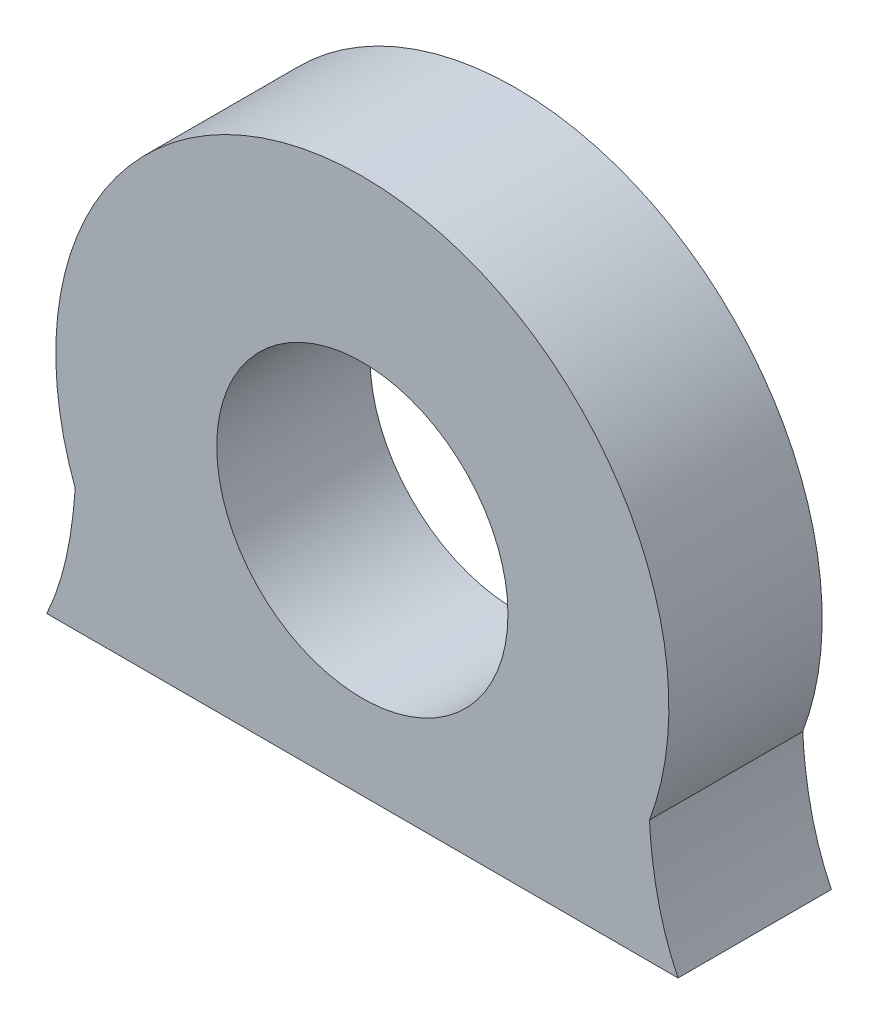
ISO-10303-21;
HEADER;
FILE_DESCRIPTION(('STEP AP214'),'2;1');
FILE_NAME('part.step','',(''),(''),'','','');
FILE_SCHEMA(('AUTOMOTIVE_DESIGN { 1 0 10303 214 1 1 1 1 }'));
ENDSEC;
DATA;
#1=APPLICATION_CONTEXT('core data for automotive mechanical design processes');
#2=APPLICATION_PROTOCOL_DEFINITION('international standard','automotive_design',2000,#1);
#3=PRODUCT_CONTEXT('',#1,'mechanical');
#4=PRODUCT('Part','Part','',(#3));
#5=PRODUCT_RELATED_PRODUCT_CATEGORY('part','',(#4));
#6=PRODUCT_DEFINITION_FORMATION('','',#4);
#7=PRODUCT_DEFINITION_CONTEXT('part definition',#1,'design');
#8=PRODUCT_DEFINITION('design','',#6,#7);
#9=PRODUCT_DEFINITION_SHAPE('','',#8);
#10=(LENGTH_UNIT() NAMED_UNIT(*) SI_UNIT(.MILLI.,.METRE.));
#11=(NAMED_UNIT(*) PLANE_ANGLE_UNIT() SI_UNIT($,.RADIAN.));
#12=(NAMED_UNIT(*) SI_UNIT($,.STERADIAN.) SOLID_ANGLE_UNIT());
#13=UNCERTAINTY_MEASURE_WITH_UNIT(LENGTH_MEASURE(1.E-05),#10,'distance_accuracy_value','');
#14=(GEOMETRIC_REPRESENTATION_CONTEXT(3) GLOBAL_UNCERTAINTY_ASSIGNED_CONTEXT((#13)) GLOBAL_UNIT_ASSIGNED_CONTEXT((#10,
#11,#12)) REPRESENTATION_CONTEXT('',''));
#15=CARTESIAN_POINT('',(0.,0.,0.));
#16=DIRECTION('',(0.,0.,1.));
#17=DIRECTION('',(1.,0.,0.));
#18=AXIS2_PLACEMENT_3D('',#15,#16,#17);
#19=CARTESIAN_POINT('',(-20.6297981408544,-15.0701075182187,10.));
#20=DIRECTION('',(0.,0.,1.));
#21=DIRECTION('',(1.,0.,0.));
#22=AXIS2_PLACEMENT_3D('',#19,#20,#21);
#23=PLANE('',#22);
#24=DIRECTION('',(-1.,0.,0.));
#25=VECTOR('',#24,1.);
#26=CARTESIAN_POINT('',(-25.,-15.,10.));
#27=LINE('',#26,#25);
#28=CARTESIAN_POINT('',(20.5984614943836,-15.,10.));
#29=VERTEX_POINT('',#28);
#30=CARTESIAN_POINT('',(-20.5962113508927,-15.,10.));
#31=VERTEX_POINT('',#30);
#32=EDGE_CURVE('E212',#29,#31,#27,.T.);
#33=ORIENTED_EDGE('',*,*,#32,.F.);
#34=CARTESIAN_POINT('',(25.,-20.,10.));
#35=CARTESIAN_POINT('',(19.2135652231186,-16.2566629580364,10.));
#36=CARTESIAN_POINT('',(18.7324741370569,-7.00674051927804,10.));
#37=B_SPLINE_CURVE_WITH_KNOTS('',2,(#34,#35,#36),.UNSPECIFIED.,.F.,.F.,(3,3),(0.,
0.763362406670874),.UNSPECIFIED.);
#38=CARTESIAN_POINT('',(18.7324741370569,-7.00674051927805,10.));
#39=VERTEX_POINT('',#38);
#40=EDGE_CURVE('E127',#29,#39,#37,.T.);
#41=ORIENTED_EDGE('',*,*,#40,.T.);
#42=CARTESIAN_POINT('',(0.,0.,10.));
#43=DIRECTION('',(0.,0.,1.));
#44=DIRECTION('',(1.,0.,0.));
#45=AXIS2_PLACEMENT_3D('',#42,#43,#44);
#46=CIRCLE('',#45,20.);
#47=CARTESIAN_POINT('',(-18.732474137057,-7.00674051927802,10.));
#48=VERTEX_POINT('',#47);
#49=EDGE_CURVE('E69',#39,#48,#46,.T.);
#50=ORIENTED_EDGE('',*,*,#49,.T.);
#51=CARTESIAN_POINT('',(-18.7324741370569,-7.00674051927804,10.));
#52=CARTESIAN_POINT('',(-19.3933592131804,-16.6368447767985,10.));
#53=CARTESIAN_POINT('',(-25.,-20.,10.));
#54=B_SPLINE_CURVE_WITH_KNOTS('',2,(#51,#52,#53),.UNSPECIFIED.,.F.,.F.,(3,3),(0.,
0.631911458603708),.UNSPECIFIED.);
#55=EDGE_CURVE('E92',#48,#31,#54,.T.);
#56=ORIENTED_EDGE('',*,*,#55,.T.);
#57=EDGE_LOOP('',(#33,#41,#50,#56));
#58=FACE_BOUND('',#57,.T.);
#59=CARTESIAN_POINT('',(0.,0.,10.));
#60=DIRECTION('',(0.,0.,1.));
#61=DIRECTION('',(1.,0.,0.));
#62=AXIS2_PLACEMENT_3D('',#59,#60,#61);
#63=CIRCLE('',#62,9.5);
#64=CARTESIAN_POINT('',(9.5,0.,10.));
#65=VERTEX_POINT('',#64);
#66=EDGE_CURVE('E104',#65,#65,#63,.T.);
#67=ORIENTED_EDGE('',*,*,#66,.F.);
#68=EDGE_LOOP('',(#67));
#69=FACE_BOUND('',#68,.T.);
#70=ADVANCED_FACE('F44',(#58,#69),#23,.T.);
#71=CARTESIAN_POINT('',(-20.6297981408544,-15.0701075182187,0.));
#72=DIRECTION('',(0.,0.,1.));
#73=DIRECTION('',(1.,0.,0.));
#74=AXIS2_PLACEMENT_3D('',#71,#72,#73);
#75=PLANE('',#74);
#76=CARTESIAN_POINT('',(25.,-20.,0.));
#77=CARTESIAN_POINT('',(19.2135652231186,-16.2566629580364,0.));
#78=CARTESIAN_POINT('',(18.7324741370569,-7.00674051927804,0.));
#79=B_SPLINE_CURVE_WITH_KNOTS('',2,(#76,#77,#78),.UNSPECIFIED.,.F.,.F.,(3,3),(0.,
0.763362406670874),.UNSPECIFIED.);
#80=CARTESIAN_POINT('',(20.5984614943836,-15.0000000000266,0.));
#81=VERTEX_POINT('',#80);
#82=CARTESIAN_POINT('',(18.7324741370569,-7.00674051927805,0.));
#83=VERTEX_POINT('',#82);
#84=EDGE_CURVE('E93',#81,#83,#79,.T.);
#85=ORIENTED_EDGE('',*,*,#84,.F.);
#86=DIRECTION('',(-1.,0.,0.));
#87=VECTOR('',#86,1.);
#88=CARTESIAN_POINT('',(-25.,-15.,0.));
#89=LINE('',#88,#87);
#90=CARTESIAN_POINT('',(-20.5962113508927,-15.,0.));
#91=VERTEX_POINT('',#90);
#92=EDGE_CURVE('E61',#81,#91,#89,.T.);
#93=ORIENTED_EDGE('',*,*,#92,.T.);
#94=CARTESIAN_POINT('',(-18.7324741370569,-7.00674051927804,0.));
#95=CARTESIAN_POINT('',(-19.3933592131804,-16.6368447767985,0.));
#96=CARTESIAN_POINT('',(-25.,-20.,0.));
#97=B_SPLINE_CURVE_WITH_KNOTS('',2,(#94,#95,#96),.UNSPECIFIED.,.F.,.F.,(3,3),(0.,
0.631911458603708),.UNSPECIFIED.);
#98=CARTESIAN_POINT('',(-18.732474137057,-7.00674051927802,0.));
#99=VERTEX_POINT('',#98);
#100=EDGE_CURVE('E98',#99,#91,#97,.T.);
#101=ORIENTED_EDGE('',*,*,#100,.F.);
#102=CARTESIAN_POINT('',(0.,0.,0.));
#103=DIRECTION('',(0.,0.,1.));
#104=DIRECTION('',(1.,0.,0.));
#105=AXIS2_PLACEMENT_3D('',#102,#103,#104);
#106=CIRCLE('',#105,20.);
#107=EDGE_CURVE('E82',#83,#99,#106,.T.);
#108=ORIENTED_EDGE('',*,*,#107,.F.);
#109=EDGE_LOOP('',(#85,#93,#101,#108));
#110=FACE_BOUND('',#109,.T.);
#111=CARTESIAN_POINT('',(0.,0.,0.));
#112=DIRECTION('',(0.,0.,1.));
#113=DIRECTION('',(1.,0.,0.));
#114=AXIS2_PLACEMENT_3D('',#111,#112,#113);
#115=CIRCLE('',#114,9.5);
#116=CARTESIAN_POINT('',(9.5,0.,0.));
#117=VERTEX_POINT('',#116);
#118=EDGE_CURVE('E110',#117,#117,#115,.T.);
#119=ORIENTED_EDGE('',*,*,#118,.T.);
#120=EDGE_LOOP('',(#119));
#121=FACE_BOUND('',#120,.T.);
#122=ADVANCED_FACE('F101',(#110,#121),#75,.F.);
#123=DIRECTION('',(0.,0.,-1.));
#124=VECTOR('',#123,1.);
#125=SURFACE_OF_LINEAR_EXTRUSION('',#54,#124);
#126=ORIENTED_EDGE('',*,*,#100,.T.);
#127=DIRECTION('',(0.,0.,-1.));
#128=VECTOR('',#127,1.);
#129=CARTESIAN_POINT('',(-20.5962113508618,-15.,10.));
#130=LINE('',#129,#128);
#131=EDGE_CURVE('E208',#91,#31,#130,.F.);
#132=ORIENTED_EDGE('',*,*,#131,.T.);
#133=ORIENTED_EDGE('',*,*,#55,.F.);
#134=DIRECTION('',(0.,0.,-1.));
#135=VECTOR('',#134,1.);
#136=CARTESIAN_POINT('',(-18.732474137057,-7.00674051927802,10.));
#137=LINE('',#136,#135);
#138=EDGE_CURVE('E85',#48,#99,#137,.T.);
#139=ORIENTED_EDGE('',*,*,#138,.T.);
#140=EDGE_LOOP('',(#126,#132,#133,#139));
#141=FACE_BOUND('',#140,.T.);
#142=ADVANCED_FACE('F46',(#141),#125,.F.);
#143=DIRECTION('',(0.,0.,-1.));
#144=VECTOR('',#143,1.);
#145=SURFACE_OF_LINEAR_EXTRUSION('',#37,#144);
#146=ORIENTED_EDGE('',*,*,#40,.F.);
#147=DIRECTION('',(0.,0.,-1.));
#148=VECTOR('',#147,1.);
#149=CARTESIAN_POINT('',(20.5984614943705,-15.,10.));
#150=LINE('',#149,#148);
#151=EDGE_CURVE('E11',#29,#81,#150,.T.);
#152=ORIENTED_EDGE('',*,*,#151,.T.);
#153=ORIENTED_EDGE('',*,*,#84,.T.);
#154=DIRECTION('',(0.,0.,-1.));
#155=VECTOR('',#154,1.);
#156=CARTESIAN_POINT('',(18.7324741370569,-7.00674051927805,10.));
#157=LINE('',#156,#155);
#158=EDGE_CURVE('E54',#39,#83,#157,.T.);
#159=ORIENTED_EDGE('',*,*,#158,.F.);
#160=EDGE_LOOP('',(#146,#152,#153,#159));
#161=FACE_BOUND('',#160,.T.);
#162=ADVANCED_FACE('F144',(#161),#145,.F.);
#163=CARTESIAN_POINT('',(0.,0.,10.));
#164=DIRECTION('',(0.,0.,-1.));
#165=DIRECTION('',(-1.,0.,0.));
#166=AXIS2_PLACEMENT_3D('',#163,#164,#165);
#167=CYLINDRICAL_SURFACE('',#166,20.);
#168=ORIENTED_EDGE('',*,*,#107,.T.);
#169=ORIENTED_EDGE('',*,*,#138,.F.);
#170=ORIENTED_EDGE('',*,*,#49,.F.);
#171=ORIENTED_EDGE('',*,*,#158,.T.);
#172=EDGE_LOOP('',(#168,#169,#170,#171));
#173=FACE_BOUND('',#172,.T.);
#174=ADVANCED_FACE('F84',(#173),#167,.T.);
#175=CARTESIAN_POINT('',(0.,0.,10.));
#176=DIRECTION('',(0.,0.,-1.));
#177=DIRECTION('',(-1.,0.,0.));
#178=AXIS2_PLACEMENT_3D('',#175,#176,#177);
#179=CYLINDRICAL_SURFACE('',#178,9.5);
#180=ORIENTED_EDGE('',*,*,#66,.T.);
#181=EDGE_LOOP('',(#180));
#182=FACE_BOUND('',#181,.T.);
#183=ORIENTED_EDGE('',*,*,#118,.F.);
#184=EDGE_LOOP('',(#183));
#185=FACE_BOUND('',#184,.T.);
#186=ADVANCED_FACE('F150',(#182,#185),#179,.F.);
#187=CARTESIAN_POINT('',(-25.,-15.,0.));
#188=DIRECTION('',(0.,1.,0.));
#189=DIRECTION('',(0.,0.,1.));
#190=AXIS2_PLACEMENT_3D('',#187,#188,#189);
#191=PLANE('',#190);
#192=ORIENTED_EDGE('',*,*,#92,.F.);
#193=ORIENTED_EDGE('',*,*,#151,.F.);
#194=ORIENTED_EDGE('',*,*,#32,.T.);
#195=ORIENTED_EDGE('',*,*,#131,.F.);
#196=EDGE_LOOP('',(#192,#193,#194,#195));
#197=FACE_BOUND('',#196,.T.);
#198=ADVANCED_FACE('F157',(#197),#191,.F.);
#199=CLOSED_SHELL('',(#70,#122,#142,#162,#174,#186,#198));
#200=MANIFOLD_SOLID_BREP('B2',#199);
#201=ADVANCED_BREP_SHAPE_REPRESENTATION('',(#18,#200),#14);
#202=SHAPE_DEFINITION_REPRESENTATION(#9,#201);
ENDSEC;
END-ISO-10303-21;
